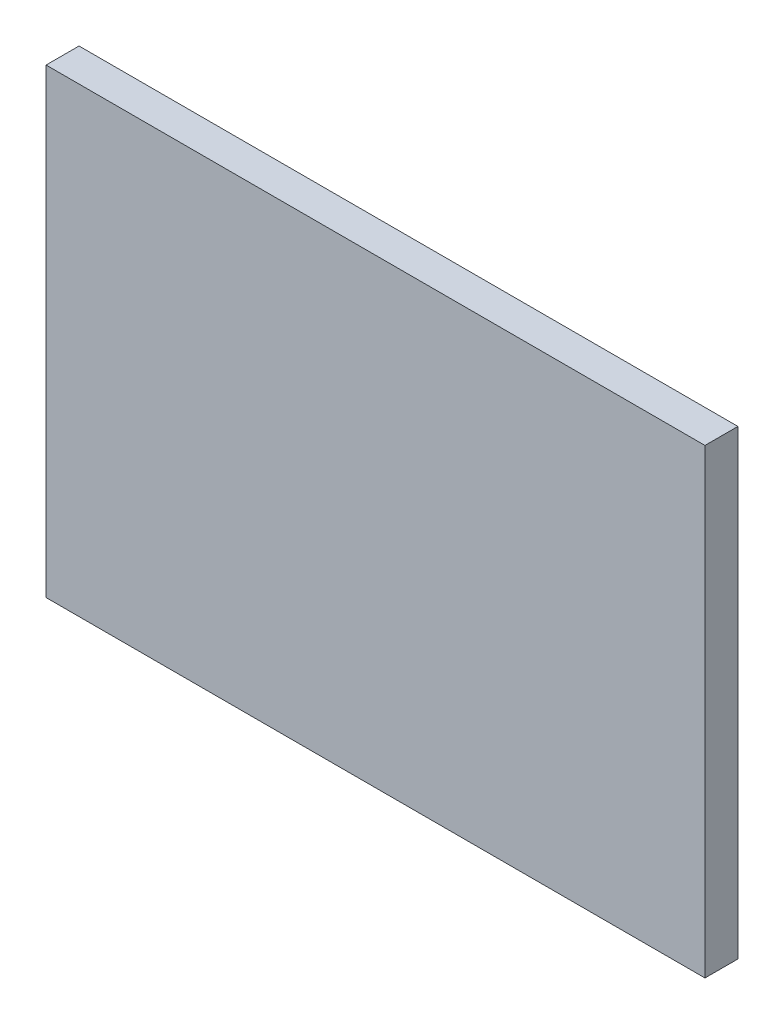
ISO-10303-21;
HEADER;
FILE_DESCRIPTION(('STEP AP214'),'2;1');
FILE_NAME('part.step','',(''),(''),'','','');
FILE_SCHEMA(('AUTOMOTIVE_DESIGN { 1 0 10303 214 1 1 1 1 }'));
ENDSEC;
DATA;
#1=APPLICATION_CONTEXT('core data for automotive mechanical design processes');
#2=APPLICATION_PROTOCOL_DEFINITION('international standard','automotive_design',2000,#1);
#3=PRODUCT_CONTEXT('',#1,'mechanical');
#4=PRODUCT('Part','Part','',(#3));
#5=PRODUCT_RELATED_PRODUCT_CATEGORY('part','',(#4));
#6=PRODUCT_DEFINITION_FORMATION('','',#4);
#7=PRODUCT_DEFINITION_CONTEXT('part definition',#1,'design');
#8=PRODUCT_DEFINITION('design','',#6,#7);
#9=PRODUCT_DEFINITION_SHAPE('','',#8);
#10=(LENGTH_UNIT() NAMED_UNIT(*) SI_UNIT(.MILLI.,.METRE.));
#11=(NAMED_UNIT(*) PLANE_ANGLE_UNIT() SI_UNIT($,.RADIAN.));
#12=(NAMED_UNIT(*) SI_UNIT($,.STERADIAN.) SOLID_ANGLE_UNIT());
#13=UNCERTAINTY_MEASURE_WITH_UNIT(LENGTH_MEASURE(1.E-05),#10,'distance_accuracy_value','');
#14=(GEOMETRIC_REPRESENTATION_CONTEXT(3) GLOBAL_UNCERTAINTY_ASSIGNED_CONTEXT((#13)) GLOBAL_UNIT_ASSIGNED_CONTEXT((#10,
#11,#12)) REPRESENTATION_CONTEXT('',''));
#15=CARTESIAN_POINT('',(0.,0.,0.));
#16=DIRECTION('',(0.,0.,1.));
#17=DIRECTION('',(1.,0.,0.));
#18=AXIS2_PLACEMENT_3D('',#15,#16,#17);
#19=CARTESIAN_POINT('',(0.,-140.,0.));
#20=DIRECTION('',(-1.,0.,0.));
#21=DIRECTION('',(0.,0.,1.));
#22=AXIS2_PLACEMENT_3D('',#19,#20,#21);
#23=PLANE('',#22);
#24=DIRECTION('',(0.,0.,1.));
#25=VECTOR('',#24,1.);
#26=CARTESIAN_POINT('',(0.,0.,0.));
#27=LINE('',#26,#25);
#28=CARTESIAN_POINT('',(0.,0.,-10.));
#29=VERTEX_POINT('',#28);
#30=CARTESIAN_POINT('',(0.,0.,0.));
#31=VERTEX_POINT('',#30);
#32=EDGE_CURVE('E97',#29,#31,#27,.T.);
#33=ORIENTED_EDGE('',*,*,#32,.F.);
#34=DIRECTION('',(0.,1.,0.));
#35=VECTOR('',#34,1.);
#36=CARTESIAN_POINT('',(0.,-140.,-10.));
#37=LINE('',#36,#35);
#38=CARTESIAN_POINT('',(0.,-140.,-10.));
#39=VERTEX_POINT('',#38);
#40=EDGE_CURVE('E11',#39,#29,#37,.T.);
#41=ORIENTED_EDGE('',*,*,#40,.F.);
#42=DIRECTION('',(0.,0.,1.));
#43=VECTOR('',#42,1.);
#44=CARTESIAN_POINT('',(0.,-140.,0.));
#45=LINE('',#44,#43);
#46=CARTESIAN_POINT('',(0.,-140.,0.));
#47=VERTEX_POINT('',#46);
#48=EDGE_CURVE('E91',#39,#47,#45,.T.);
#49=ORIENTED_EDGE('',*,*,#48,.T.);
#50=DIRECTION('',(0.,1.,0.));
#51=VECTOR('',#50,1.);
#52=CARTESIAN_POINT('',(0.,-140.,0.));
#53=LINE('',#52,#51);
#54=EDGE_CURVE('E36',#47,#31,#53,.T.);
#55=ORIENTED_EDGE('',*,*,#54,.T.);
#56=EDGE_LOOP('',(#33,#41,#49,#55));
#57=FACE_BOUND('',#56,.T.);
#58=ADVANCED_FACE('F33',(#57),#23,.T.);
#59=CARTESIAN_POINT('',(0.,-140.,-10.));
#60=DIRECTION('',(0.,0.,-1.));
#61=DIRECTION('',(-1.,0.,0.));
#62=AXIS2_PLACEMENT_3D('',#59,#60,#61);
#63=PLANE('',#62);
#64=DIRECTION('',(-1.,0.,0.));
#65=VECTOR('',#64,1.);
#66=CARTESIAN_POINT('',(0.,0.,-10.));
#67=LINE('',#66,#65);
#68=CARTESIAN_POINT('',(200.,0.,-10.));
#69=VERTEX_POINT('',#68);
#70=EDGE_CURVE('E93',#69,#29,#67,.T.);
#71=ORIENTED_EDGE('',*,*,#70,.F.);
#72=DIRECTION('',(0.,1.,0.));
#73=VECTOR('',#72,1.);
#74=CARTESIAN_POINT('',(200.,-140.,-10.));
#75=LINE('',#74,#73);
#76=CARTESIAN_POINT('',(200.,-140.,-10.));
#77=VERTEX_POINT('',#76);
#78=EDGE_CURVE('E42',#77,#69,#75,.T.);
#79=ORIENTED_EDGE('',*,*,#78,.F.);
#80=DIRECTION('',(-1.,0.,0.));
#81=VECTOR('',#80,1.);
#82=CARTESIAN_POINT('',(0.,-140.,-10.));
#83=LINE('',#82,#81);
#84=EDGE_CURVE('E88',#77,#39,#83,.T.);
#85=ORIENTED_EDGE('',*,*,#84,.T.);
#86=ORIENTED_EDGE('',*,*,#40,.T.);
#87=EDGE_LOOP('',(#71,#79,#85,#86));
#88=FACE_BOUND('',#87,.T.);
#89=ADVANCED_FACE('F107',(#88),#63,.T.);
#90=CARTESIAN_POINT('',(200.,-140.,0.));
#91=DIRECTION('',(1.,0.,0.));
#92=DIRECTION('',(0.,0.,-1.));
#93=AXIS2_PLACEMENT_3D('',#90,#91,#92);
#94=PLANE('',#93);
#95=DIRECTION('',(0.,0.,-1.));
#96=VECTOR('',#95,1.);
#97=CARTESIAN_POINT('',(200.,0.,0.));
#98=LINE('',#97,#96);
#99=CARTESIAN_POINT('',(200.,0.,0.));
#100=VERTEX_POINT('',#99);
#101=EDGE_CURVE('E83',#100,#69,#98,.T.);
#102=ORIENTED_EDGE('',*,*,#101,.F.);
#103=DIRECTION('',(0.,1.,0.));
#104=VECTOR('',#103,1.);
#105=CARTESIAN_POINT('',(200.,-140.,0.));
#106=LINE('',#105,#104);
#107=CARTESIAN_POINT('',(200.,-140.,0.));
#108=VERTEX_POINT('',#107);
#109=EDGE_CURVE('E78',#108,#100,#106,.T.);
#110=ORIENTED_EDGE('',*,*,#109,.F.);
#111=DIRECTION('',(0.,0.,-1.));
#112=VECTOR('',#111,1.);
#113=CARTESIAN_POINT('',(200.,-140.,0.));
#114=LINE('',#113,#112);
#115=EDGE_CURVE('E81',#108,#77,#114,.T.);
#116=ORIENTED_EDGE('',*,*,#115,.T.);
#117=ORIENTED_EDGE('',*,*,#78,.T.);
#118=EDGE_LOOP('',(#102,#110,#116,#117));
#119=FACE_BOUND('',#118,.T.);
#120=ADVANCED_FACE('F80',(#119),#94,.T.);
#121=CARTESIAN_POINT('',(0.,-140.,0.));
#122=DIRECTION('',(0.,0.,1.));
#123=DIRECTION('',(1.,0.,0.));
#124=AXIS2_PLACEMENT_3D('',#121,#122,#123);
#125=PLANE('',#124);
#126=DIRECTION('',(1.,0.,0.));
#127=VECTOR('',#126,1.);
#128=CARTESIAN_POINT('',(0.,0.,0.));
#129=LINE('',#128,#127);
#130=EDGE_CURVE('E100',#31,#100,#129,.T.);
#131=ORIENTED_EDGE('',*,*,#130,.F.);
#132=ORIENTED_EDGE('',*,*,#54,.F.);
#133=DIRECTION('',(1.,0.,0.));
#134=VECTOR('',#133,1.);
#135=CARTESIAN_POINT('',(0.,-140.,0.));
#136=LINE('',#135,#134);
#137=EDGE_CURVE('E87',#47,#108,#136,.T.);
#138=ORIENTED_EDGE('',*,*,#137,.T.);
#139=ORIENTED_EDGE('',*,*,#109,.T.);
#140=EDGE_LOOP('',(#131,#132,#138,#139));
#141=FACE_BOUND('',#140,.T.);
#142=ADVANCED_FACE('F90',(#141),#125,.T.);
#143=CARTESIAN_POINT('',(0.,-140.,0.));
#144=DIRECTION('',(0.,-1.,0.));
#145=DIRECTION('',(0.,0.,-1.));
#146=AXIS2_PLACEMENT_3D('',#143,#144,#145);
#147=PLANE('',#146);
#148=ORIENTED_EDGE('',*,*,#48,.F.);
#149=ORIENTED_EDGE('',*,*,#84,.F.);
#150=ORIENTED_EDGE('',*,*,#115,.F.);
#151=ORIENTED_EDGE('',*,*,#137,.F.);
#152=EDGE_LOOP('',(#148,#149,#150,#151));
#153=FACE_BOUND('',#152,.T.);
#154=ADVANCED_FACE('F86',(#153),#147,.T.);
#155=CARTESIAN_POINT('',(0.,0.,0.));
#156=DIRECTION('',(0.,-1.,0.));
#157=DIRECTION('',(0.,0.,-1.));
#158=AXIS2_PLACEMENT_3D('',#155,#156,#157);
#159=PLANE('',#158);
#160=ORIENTED_EDGE('',*,*,#32,.T.);
#161=ORIENTED_EDGE('',*,*,#130,.T.);
#162=ORIENTED_EDGE('',*,*,#101,.T.);
#163=ORIENTED_EDGE('',*,*,#70,.T.);
#164=EDGE_LOOP('',(#160,#161,#162,#163));
#165=FACE_BOUND('',#164,.T.);
#166=ADVANCED_FACE('F106',(#165),#159,.F.);
#167=CLOSED_SHELL('',(#58,#89,#120,#142,#154,#166));
#168=MANIFOLD_SOLID_BREP('B2',#167);
#169=ADVANCED_BREP_SHAPE_REPRESENTATION('',(#18,#168),#14);
#170=SHAPE_DEFINITION_REPRESENTATION(#9,#169);
ENDSEC;
END-ISO-10303-21;
